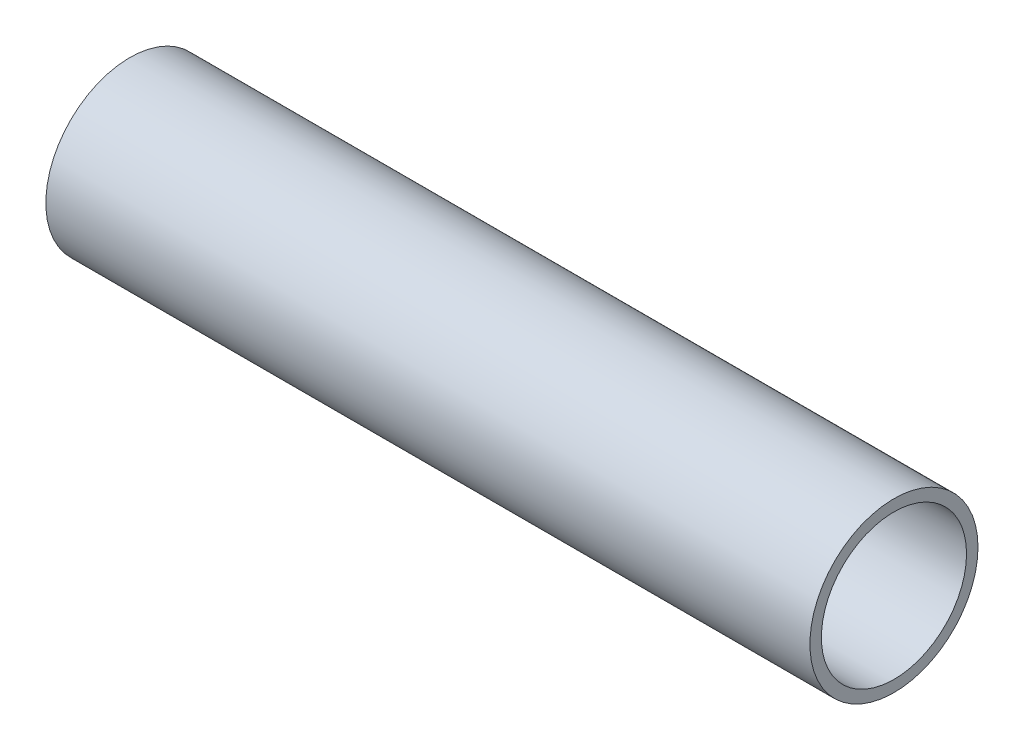
ISO-10303-21;
HEADER;
FILE_DESCRIPTION(('STEP AP214'),'2;1');
FILE_NAME('part.step','',(''),(''),'','','');
FILE_SCHEMA(('AUTOMOTIVE_DESIGN { 1 0 10303 214 1 1 1 1 }'));
ENDSEC;
DATA;
#1=APPLICATION_CONTEXT('core data for automotive mechanical design processes');
#2=APPLICATION_PROTOCOL_DEFINITION('international standard','automotive_design',2000,#1);
#3=PRODUCT_CONTEXT('',#1,'mechanical');
#4=PRODUCT('Part','Part','',(#3));
#5=PRODUCT_RELATED_PRODUCT_CATEGORY('part','',(#4));
#6=PRODUCT_DEFINITION_FORMATION('','',#4);
#7=PRODUCT_DEFINITION_CONTEXT('part definition',#1,'design');
#8=PRODUCT_DEFINITION('design','',#6,#7);
#9=PRODUCT_DEFINITION_SHAPE('','',#8);
#10=(LENGTH_UNIT() NAMED_UNIT(*) SI_UNIT(.MILLI.,.METRE.));
#11=(NAMED_UNIT(*) PLANE_ANGLE_UNIT() SI_UNIT($,.RADIAN.));
#12=(NAMED_UNIT(*) SI_UNIT($,.STERADIAN.) SOLID_ANGLE_UNIT());
#13=UNCERTAINTY_MEASURE_WITH_UNIT(LENGTH_MEASURE(1.E-05),#10,'distance_accuracy_value','');
#14=(GEOMETRIC_REPRESENTATION_CONTEXT(3) GLOBAL_UNCERTAINTY_ASSIGNED_CONTEXT((#13)) GLOBAL_UNIT_ASSIGNED_CONTEXT((#10,
#11,#12)) REPRESENTATION_CONTEXT('',''));
#15=CARTESIAN_POINT('',(0.,0.,0.));
#16=DIRECTION('',(0.,0.,1.));
#17=DIRECTION('',(1.,0.,0.));
#18=AXIS2_PLACEMENT_3D('',#15,#16,#17);
#19=CARTESIAN_POINT('',(100.,0.,0.));
#20=DIRECTION('',(1.,0.,0.));
#21=DIRECTION('',(0.,0.,-1.));
#22=AXIS2_PLACEMENT_3D('',#19,#20,#21);
#23=PLANE('',#22);
#24=CARTESIAN_POINT('',(100.,0.,0.));
#25=DIRECTION('',(1.,0.,0.));
#26=DIRECTION('',(0.,0.,-1.));
#27=AXIS2_PLACEMENT_3D('',#24,#25,#26);
#28=CIRCLE('',#27,11.);
#29=CARTESIAN_POINT('',(100.,0.,-11.));
#30=VERTEX_POINT('',#29);
#31=EDGE_CURVE('E10',#30,#30,#28,.T.);
#32=ORIENTED_EDGE('',*,*,#31,.T.);
#33=EDGE_LOOP('',(#32));
#34=FACE_BOUND('',#33,.T.);
#35=CARTESIAN_POINT('',(100.,0.,0.));
#36=DIRECTION('',(1.,0.,0.));
#37=DIRECTION('',(0.,0.,-1.));
#38=AXIS2_PLACEMENT_3D('',#35,#36,#37);
#39=CIRCLE('',#38,9.5);
#40=CARTESIAN_POINT('',(100.,0.,-9.5));
#41=VERTEX_POINT('',#40);
#42=EDGE_CURVE('E39',#41,#41,#39,.T.);
#43=ORIENTED_EDGE('',*,*,#42,.F.);
#44=EDGE_LOOP('',(#43));
#45=FACE_BOUND('',#44,.T.);
#46=ADVANCED_FACE('F28',(#34,#45),#23,.T.);
#47=CARTESIAN_POINT('',(0.,0.,0.));
#48=DIRECTION('',(1.,0.,0.));
#49=DIRECTION('',(0.,0.,-1.));
#50=AXIS2_PLACEMENT_3D('',#47,#48,#49);
#51=PLANE('',#50);
#52=CARTESIAN_POINT('',(0.,0.,0.));
#53=DIRECTION('',(1.,0.,0.));
#54=DIRECTION('',(0.,0.,-1.));
#55=AXIS2_PLACEMENT_3D('',#52,#53,#54);
#56=CIRCLE('',#55,11.);
#57=CARTESIAN_POINT('',(0.,0.,-11.));
#58=VERTEX_POINT('',#57);
#59=EDGE_CURVE('E32',#58,#58,#56,.T.);
#60=ORIENTED_EDGE('',*,*,#59,.F.);
#61=EDGE_LOOP('',(#60));
#62=FACE_BOUND('',#61,.T.);
#63=CARTESIAN_POINT('',(0.,0.,0.));
#64=DIRECTION('',(1.,0.,0.));
#65=DIRECTION('',(0.,0.,-1.));
#66=AXIS2_PLACEMENT_3D('',#63,#64,#65);
#67=CIRCLE('',#66,9.5);
#68=CARTESIAN_POINT('',(0.,0.,-9.5));
#69=VERTEX_POINT('',#68);
#70=EDGE_CURVE('E41',#69,#69,#67,.T.);
#71=ORIENTED_EDGE('',*,*,#70,.T.);
#72=EDGE_LOOP('',(#71));
#73=FACE_BOUND('',#72,.T.);
#74=ADVANCED_FACE('F51',(#62,#73),#51,.F.);
#75=CARTESIAN_POINT('',(100.,0.,0.));
#76=DIRECTION('',(-1.,0.,0.));
#77=DIRECTION('',(0.,0.,1.));
#78=AXIS2_PLACEMENT_3D('',#75,#76,#77);
#79=CYLINDRICAL_SURFACE('',#78,11.);
#80=ORIENTED_EDGE('',*,*,#31,.F.);
#81=EDGE_LOOP('',(#80));
#82=FACE_BOUND('',#81,.T.);
#83=ORIENTED_EDGE('',*,*,#59,.T.);
#84=EDGE_LOOP('',(#83));
#85=FACE_BOUND('',#84,.T.);
#86=ADVANCED_FACE('F30',(#82,#85),#79,.T.);
#87=CARTESIAN_POINT('',(100.,0.,0.));
#88=DIRECTION('',(-1.,0.,0.));
#89=DIRECTION('',(0.,0.,1.));
#90=AXIS2_PLACEMENT_3D('',#87,#88,#89);
#91=CYLINDRICAL_SURFACE('',#90,9.5);
#92=ORIENTED_EDGE('',*,*,#42,.T.);
#93=EDGE_LOOP('',(#92));
#94=FACE_BOUND('',#93,.T.);
#95=ORIENTED_EDGE('',*,*,#70,.F.);
#96=EDGE_LOOP('',(#95));
#97=FACE_BOUND('',#96,.T.);
#98=ADVANCED_FACE('F47',(#94,#97),#91,.F.);
#99=CLOSED_SHELL('',(#46,#74,#86,#98));
#100=MANIFOLD_SOLID_BREP('B2',#99);
#101=ADVANCED_BREP_SHAPE_REPRESENTATION('',(#18,#100),#14);
#102=SHAPE_DEFINITION_REPRESENTATION(#9,#101);
ENDSEC;
END-ISO-10303-21;
